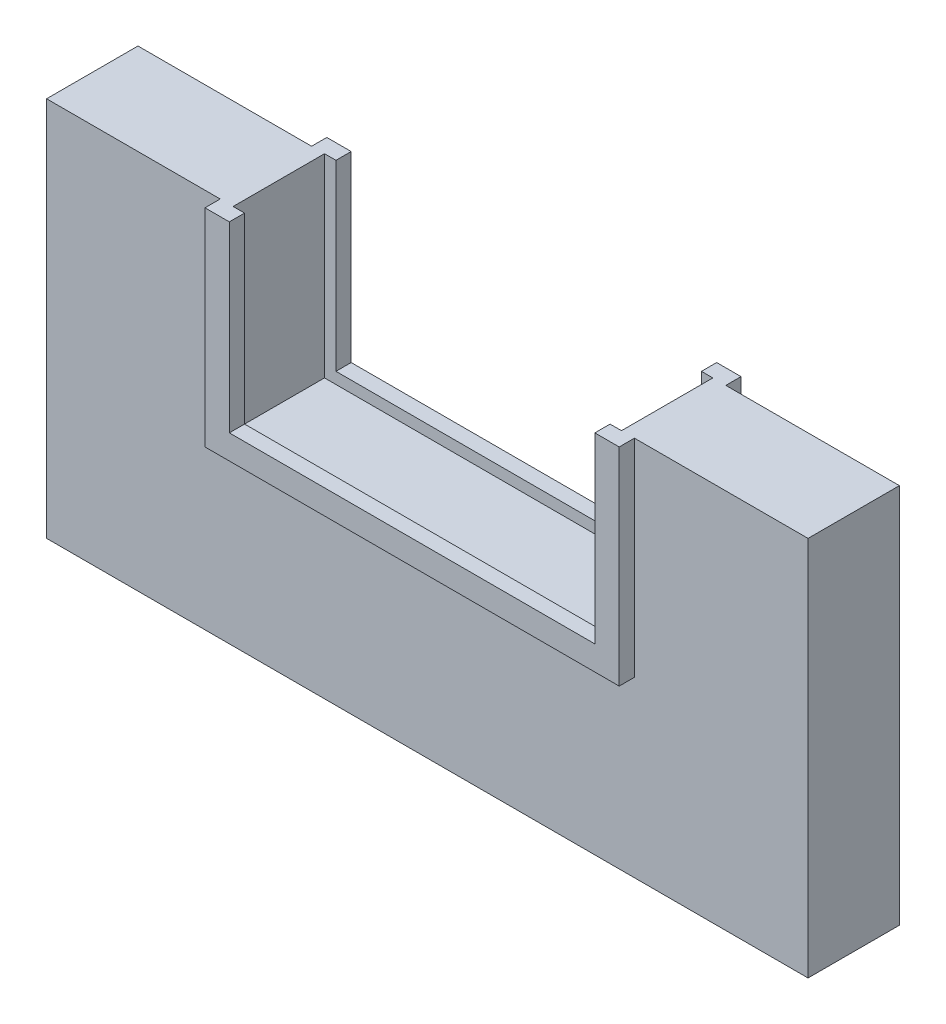
ISO-10303-21;
HEADER;
FILE_DESCRIPTION(('STEP AP214'),'2;1');
FILE_NAME('part.step','',(''),(''),'','','');
FILE_SCHEMA(('AUTOMOTIVE_DESIGN { 1 0 10303 214 1 1 1 1 }'));
ENDSEC;
DATA;
#1=APPLICATION_CONTEXT('core data for automotive mechanical design processes');
#2=APPLICATION_PROTOCOL_DEFINITION('international standard','automotive_design',2000,#1);
#3=PRODUCT_CONTEXT('',#1,'mechanical');
#4=PRODUCT('Part','Part','',(#3));
#5=PRODUCT_RELATED_PRODUCT_CATEGORY('part','',(#4));
#6=PRODUCT_DEFINITION_FORMATION('','',#4);
#7=PRODUCT_DEFINITION_CONTEXT('part definition',#1,'design');
#8=PRODUCT_DEFINITION('design','',#6,#7);
#9=PRODUCT_DEFINITION_SHAPE('','',#8);
#10=(LENGTH_UNIT() NAMED_UNIT(*) SI_UNIT(.MILLI.,.METRE.));
#11=(NAMED_UNIT(*) PLANE_ANGLE_UNIT() SI_UNIT($,.RADIAN.));
#12=(NAMED_UNIT(*) SI_UNIT($,.STERADIAN.) SOLID_ANGLE_UNIT());
#13=UNCERTAINTY_MEASURE_WITH_UNIT(LENGTH_MEASURE(1.E-05),#10,'distance_accuracy_value','');
#14=(GEOMETRIC_REPRESENTATION_CONTEXT(3) GLOBAL_UNCERTAINTY_ASSIGNED_CONTEXT((#13)) GLOBAL_UNIT_ASSIGNED_CONTEXT((#10,
#11,#12)) REPRESENTATION_CONTEXT('',''));
#15=CARTESIAN_POINT('',(0.,0.,0.));
#16=DIRECTION('',(0.,0.,1.));
#17=DIRECTION('',(1.,0.,0.));
#18=AXIS2_PLACEMENT_3D('',#15,#16,#17);
#19=CARTESIAN_POINT('',(12.5,6.25,3.));
#20=DIRECTION('',(0.,-1.,0.));
#21=DIRECTION('',(1.,0.,0.));
#22=AXIS2_PLACEMENT_3D('',#19,#20,#21);
#23=PLANE('',#22);
#24=DIRECTION('',(-1.,0.,0.));
#25=VECTOR('',#24,1.);
#26=CARTESIAN_POINT('',(-6.8,6.25,3.5));
#27=LINE('',#26,#25);
#28=CARTESIAN_POINT('',(-6.,6.25,3.5));
#29=VERTEX_POINT('',#28);
#30=CARTESIAN_POINT('',(-6.8,6.25,3.5));
#31=VERTEX_POINT('',#30);
#32=EDGE_CURVE('E318',#29,#31,#27,.T.);
#33=ORIENTED_EDGE('',*,*,#32,.F.);
#34=DIRECTION('',(0.,0.,1.));
#35=VECTOR('',#34,1.);
#36=CARTESIAN_POINT('',(-6.,6.25,-1.5));
#37=LINE('',#36,#35);
#38=CARTESIAN_POINT('',(-6.,6.25,3.));
#39=VERTEX_POINT('',#38);
#40=EDGE_CURVE('E215',#39,#29,#37,.T.);
#41=ORIENTED_EDGE('',*,*,#40,.F.);
#42=DIRECTION('',(-1.,0.,0.));
#43=VECTOR('',#42,1.);
#44=CARTESIAN_POINT('',(-6.375,6.25,3.));
#45=LINE('',#44,#43);
#46=CARTESIAN_POINT('',(-6.375,6.25,3.));
#47=VERTEX_POINT('',#46);
#48=EDGE_CURVE('E289',#39,#47,#45,.T.);
#49=ORIENTED_EDGE('',*,*,#48,.T.);
#50=DIRECTION('',(0.,0.,1.));
#51=VECTOR('',#50,1.);
#52=CARTESIAN_POINT('',(-6.375,6.25,0.));
#53=LINE('',#52,#51);
#54=CARTESIAN_POINT('',(-6.375,6.25,0.));
#55=VERTEX_POINT('',#54);
#56=EDGE_CURVE('E293',#55,#47,#53,.T.);
#57=ORIENTED_EDGE('',*,*,#56,.F.);
#58=DIRECTION('',(-1.,0.,0.));
#59=VECTOR('',#58,1.);
#60=CARTESIAN_POINT('',(-6.375,6.25,0.));
#61=LINE('',#60,#59);
#62=CARTESIAN_POINT('',(-6.,6.25,0.));
#63=VERTEX_POINT('',#62);
#64=EDGE_CURVE('E273',#63,#55,#61,.T.);
#65=ORIENTED_EDGE('',*,*,#64,.F.);
#66=CARTESIAN_POINT('',(-6.,6.25,-0.5));
#67=VERTEX_POINT('',#66);
#68=EDGE_CURVE('E229',#67,#63,#37,.T.);
#69=ORIENTED_EDGE('',*,*,#68,.F.);
#70=DIRECTION('',(-1.,0.,0.));
#71=VECTOR('',#70,1.);
#72=CARTESIAN_POINT('',(-6.8,6.25,-0.5));
#73=LINE('',#72,#71);
#74=CARTESIAN_POINT('',(-6.8,6.25,-0.5));
#75=VERTEX_POINT('',#74);
#76=EDGE_CURVE('E334',#67,#75,#73,.T.);
#77=ORIENTED_EDGE('',*,*,#76,.T.);
#78=DIRECTION('',(0.,0.,-1.));
#79=VECTOR('',#78,1.);
#80=CARTESIAN_POINT('',(-6.8,6.25,3.5));
#81=LINE('',#80,#79);
#82=CARTESIAN_POINT('',(-6.8,6.25,0.));
#83=VERTEX_POINT('',#82);
#84=EDGE_CURVE('E322',#83,#75,#81,.T.);
#85=ORIENTED_EDGE('',*,*,#84,.F.);
#86=DIRECTION('',(-1.,0.,0.));
#87=VECTOR('',#86,1.);
#88=CARTESIAN_POINT('',(12.5,6.25,0.));
#89=LINE('',#88,#87);
#90=CARTESIAN_POINT('',(-12.5,6.25,0.));
#91=VERTEX_POINT('',#90);
#92=EDGE_CURVE('E393',#83,#91,#89,.T.);
#93=ORIENTED_EDGE('',*,*,#92,.T.);
#94=DIRECTION('',(0.,0.,-1.));
#95=VECTOR('',#94,1.);
#96=CARTESIAN_POINT('',(-12.5,6.25,3.));
#97=LINE('',#96,#95);
#98=CARTESIAN_POINT('',(-12.5,6.25,3.));
#99=VERTEX_POINT('',#98);
#100=EDGE_CURVE('E383',#99,#91,#97,.T.);
#101=ORIENTED_EDGE('',*,*,#100,.F.);
#102=DIRECTION('',(-1.,0.,0.));
#103=VECTOR('',#102,1.);
#104=CARTESIAN_POINT('',(12.5,6.25,3.));
#105=LINE('',#104,#103);
#106=CARTESIAN_POINT('',(-6.8,6.25,3.));
#107=VERTEX_POINT('',#106);
#108=EDGE_CURVE('E379',#107,#99,#105,.T.);
#109=ORIENTED_EDGE('',*,*,#108,.F.);
#110=EDGE_CURVE('E338',#31,#107,#81,.T.);
#111=ORIENTED_EDGE('',*,*,#110,.F.);
#112=EDGE_LOOP('',(#33,#41,#49,#57,#65,#69,#77,#85,#93,#101,#109,#111));
#113=FACE_BOUND('',#112,.T.);
#114=ADVANCED_FACE('F39',(#113),#23,.F.);
#115=CARTESIAN_POINT('',(6.8,6.25,-0.5));
#116=VERTEX_POINT('',#115);
#117=CARTESIAN_POINT('',(6.,6.25,-0.5));
#118=VERTEX_POINT('',#117);
#119=EDGE_CURVE('E312',#116,#118,#73,.T.);
#120=ORIENTED_EDGE('',*,*,#119,.T.);
#121=DIRECTION('',(0.,0.,1.));
#122=VECTOR('',#121,1.);
#123=CARTESIAN_POINT('',(6.,6.25,-1.5));
#124=LINE('',#123,#122);
#125=CARTESIAN_POINT('',(6.,6.25,0.));
#126=VERTEX_POINT('',#125);
#127=EDGE_CURVE('E230',#118,#126,#124,.T.);
#128=ORIENTED_EDGE('',*,*,#127,.T.);
#129=CARTESIAN_POINT('',(6.375,6.25,0.));
#130=VERTEX_POINT('',#129);
#131=EDGE_CURVE('E274',#130,#126,#61,.T.);
#132=ORIENTED_EDGE('',*,*,#131,.F.);
#133=DIRECTION('',(0.,0.,1.));
#134=VECTOR('',#133,1.);
#135=CARTESIAN_POINT('',(6.375,6.25,0.));
#136=LINE('',#135,#134);
#137=CARTESIAN_POINT('',(6.375,6.25,3.));
#138=VERTEX_POINT('',#137);
#139=EDGE_CURVE('E298',#130,#138,#136,.T.);
#140=ORIENTED_EDGE('',*,*,#139,.T.);
#141=CARTESIAN_POINT('',(6.,6.25,3.));
#142=VERTEX_POINT('',#141);
#143=EDGE_CURVE('E265',#138,#142,#45,.T.);
#144=ORIENTED_EDGE('',*,*,#143,.T.);
#145=CARTESIAN_POINT('',(6.,6.25,3.5));
#146=VERTEX_POINT('',#145);
#147=EDGE_CURVE('E231',#142,#146,#124,.T.);
#148=ORIENTED_EDGE('',*,*,#147,.T.);
#149=CARTESIAN_POINT('',(6.8,6.25,3.5));
#150=VERTEX_POINT('',#149);
#151=EDGE_CURVE('E319',#150,#146,#27,.T.);
#152=ORIENTED_EDGE('',*,*,#151,.F.);
#153=DIRECTION('',(0.,0.,-1.));
#154=VECTOR('',#153,1.);
#155=CARTESIAN_POINT('',(6.8,6.25,3.5));
#156=LINE('',#155,#154);
#157=CARTESIAN_POINT('',(6.8,6.25,3.));
#158=VERTEX_POINT('',#157);
#159=EDGE_CURVE('E343',#150,#158,#156,.T.);
#160=ORIENTED_EDGE('',*,*,#159,.T.);
#161=CARTESIAN_POINT('',(12.5,6.25,3.));
#162=VERTEX_POINT('',#161);
#163=EDGE_CURVE('E380',#162,#158,#105,.T.);
#164=ORIENTED_EDGE('',*,*,#163,.F.);
#165=DIRECTION('',(0.,0.,-1.));
#166=VECTOR('',#165,1.);
#167=CARTESIAN_POINT('',(12.5,6.25,3.));
#168=LINE('',#167,#166);
#169=CARTESIAN_POINT('',(12.5,6.25,0.));
#170=VERTEX_POINT('',#169);
#171=EDGE_CURVE('E400',#162,#170,#168,.T.);
#172=ORIENTED_EDGE('',*,*,#171,.T.);
#173=CARTESIAN_POINT('',(6.8,6.25,0.));
#174=VERTEX_POINT('',#173);
#175=EDGE_CURVE('E373',#170,#174,#89,.T.);
#176=ORIENTED_EDGE('',*,*,#175,.T.);
#177=EDGE_CURVE('E342',#174,#116,#156,.T.);
#178=ORIENTED_EDGE('',*,*,#177,.T.);
#179=EDGE_LOOP('',(#120,#128,#132,#140,#144,#148,#152,#160,#164,#172,#176,#178));
#180=FACE_BOUND('',#179,.T.);
#181=ADVANCED_FACE('F432',(#180),#23,.F.);
#182=CARTESIAN_POINT('',(0.,0.,3.));
#183=DIRECTION('',(0.,0.,1.));
#184=DIRECTION('',(1.,0.,0.));
#185=AXIS2_PLACEMENT_3D('',#182,#183,#184);
#186=PLANE('',#185);
#187=DIRECTION('',(-1.,0.,0.));
#188=VECTOR('',#187,1.);
#189=CARTESIAN_POINT('',(0.,-0.550000000000001,3.));
#190=LINE('',#189,#188);
#191=CARTESIAN_POINT('',(6.80000000000001,-0.550000000000001,3.));
#192=VERTEX_POINT('',#191);
#193=CARTESIAN_POINT('',(-6.8,-0.550000000000001,3.));
#194=VERTEX_POINT('',#193);
#195=EDGE_CURVE('E360',#192,#194,#190,.T.);
#196=ORIENTED_EDGE('',*,*,#195,.T.);
#197=DIRECTION('',(0.,1.,0.));
#198=VECTOR('',#197,1.);
#199=CARTESIAN_POINT('',(-6.8,0.,3.));
#200=LINE('',#199,#198);
#201=EDGE_CURVE('E363',#194,#107,#200,.T.);
#202=ORIENTED_EDGE('',*,*,#201,.T.);
#203=ORIENTED_EDGE('',*,*,#108,.T.);
#204=DIRECTION('',(0.,-1.,0.));
#205=VECTOR('',#204,1.);
#206=CARTESIAN_POINT('',(-12.5,-6.25,3.));
#207=LINE('',#206,#205);
#208=CARTESIAN_POINT('',(-12.5,-6.25,3.));
#209=VERTEX_POINT('',#208);
#210=EDGE_CURVE('E368',#99,#209,#207,.T.);
#211=ORIENTED_EDGE('',*,*,#210,.T.);
#212=DIRECTION('',(1.,0.,0.));
#213=VECTOR('',#212,1.);
#214=CARTESIAN_POINT('',(12.5,-6.25,3.));
#215=LINE('',#214,#213);
#216=CARTESIAN_POINT('',(12.5,-6.25,3.));
#217=VERTEX_POINT('',#216);
#218=EDGE_CURVE('E372',#209,#217,#215,.T.);
#219=ORIENTED_EDGE('',*,*,#218,.T.);
#220=DIRECTION('',(0.,1.,0.));
#221=VECTOR('',#220,1.);
#222=CARTESIAN_POINT('',(12.5,-6.25,3.));
#223=LINE('',#222,#221);
#224=EDGE_CURVE('E376',#217,#162,#223,.T.);
#225=ORIENTED_EDGE('',*,*,#224,.T.);
#226=ORIENTED_EDGE('',*,*,#163,.T.);
#227=DIRECTION('',(0.,-1.,0.));
#228=VECTOR('',#227,1.);
#229=CARTESIAN_POINT('',(6.80000000000001,0.,3.));
#230=LINE('',#229,#228);
#231=EDGE_CURVE('E357',#158,#192,#230,.T.);
#232=ORIENTED_EDGE('',*,*,#231,.T.);
#233=EDGE_LOOP('',(#196,#202,#203,#211,#219,#225,#226,#232));
#234=FACE_BOUND('',#233,.T.);
#235=ADVANCED_FACE('F481',(#234),#186,.T.);
#236=CARTESIAN_POINT('',(0.,0.,0.));
#237=DIRECTION('',(0.,0.,1.));
#238=DIRECTION('',(1.,0.,0.));
#239=AXIS2_PLACEMENT_3D('',#236,#237,#238);
#240=PLANE('',#239);
#241=DIRECTION('',(0.,1.,0.));
#242=VECTOR('',#241,1.);
#243=CARTESIAN_POINT('',(-6.8,0.,0.));
#244=LINE('',#243,#242);
#245=CARTESIAN_POINT('',(-6.8,-0.550000000000001,0.));
#246=VERTEX_POINT('',#245);
#247=EDGE_CURVE('E418',#246,#83,#244,.T.);
#248=ORIENTED_EDGE('',*,*,#247,.F.);
#249=DIRECTION('',(-1.,0.,0.));
#250=VECTOR('',#249,1.);
#251=CARTESIAN_POINT('',(0.,-0.550000000000001,0.));
#252=LINE('',#251,#250);
#253=CARTESIAN_POINT('',(6.80000000000001,-0.550000000000001,0.));
#254=VERTEX_POINT('',#253);
#255=EDGE_CURVE('E415',#254,#246,#252,.T.);
#256=ORIENTED_EDGE('',*,*,#255,.F.);
#257=DIRECTION('',(0.,-1.,0.));
#258=VECTOR('',#257,1.);
#259=CARTESIAN_POINT('',(6.80000000000001,0.,0.));
#260=LINE('',#259,#258);
#261=EDGE_CURVE('E412',#174,#254,#260,.T.);
#262=ORIENTED_EDGE('',*,*,#261,.F.);
#263=ORIENTED_EDGE('',*,*,#175,.F.);
#264=DIRECTION('',(0.,1.,0.));
#265=VECTOR('',#264,1.);
#266=CARTESIAN_POINT('',(12.5,-6.25,0.));
#267=LINE('',#266,#265);
#268=CARTESIAN_POINT('',(12.5,-6.25,0.));
#269=VERTEX_POINT('',#268);
#270=EDGE_CURVE('E390',#269,#170,#267,.T.);
#271=ORIENTED_EDGE('',*,*,#270,.F.);
#272=DIRECTION('',(1.,0.,0.));
#273=VECTOR('',#272,1.);
#274=CARTESIAN_POINT('',(12.5,-6.25,0.));
#275=LINE('',#274,#273);
#276=CARTESIAN_POINT('',(-12.5,-6.25,0.));
#277=VERTEX_POINT('',#276);
#278=EDGE_CURVE('E387',#277,#269,#275,.T.);
#279=ORIENTED_EDGE('',*,*,#278,.F.);
#280=DIRECTION('',(0.,-1.,0.));
#281=VECTOR('',#280,1.);
#282=CARTESIAN_POINT('',(-12.5,-6.25,0.));
#283=LINE('',#282,#281);
#284=EDGE_CURVE('E367',#91,#277,#283,.T.);
#285=ORIENTED_EDGE('',*,*,#284,.F.);
#286=ORIENTED_EDGE('',*,*,#92,.F.);
#287=EDGE_LOOP('',(#248,#256,#262,#263,#271,#279,#285,#286));
#288=FACE_BOUND('',#287,.T.);
#289=ADVANCED_FACE('F484',(#288),#240,.F.);
#290=CARTESIAN_POINT('',(-12.5,-6.25,3.));
#291=DIRECTION('',(1.,0.,0.));
#292=DIRECTION('',(0.,0.,-1.));
#293=AXIS2_PLACEMENT_3D('',#290,#291,#292);
#294=PLANE('',#293);
#295=ORIENTED_EDGE('',*,*,#284,.T.);
#296=DIRECTION('',(0.,0.,-1.));
#297=VECTOR('',#296,1.);
#298=CARTESIAN_POINT('',(-12.5,-6.25,3.));
#299=LINE('',#298,#297);
#300=EDGE_CURVE('E408',#209,#277,#299,.T.);
#301=ORIENTED_EDGE('',*,*,#300,.F.);
#302=ORIENTED_EDGE('',*,*,#210,.F.);
#303=ORIENTED_EDGE('',*,*,#100,.T.);
#304=EDGE_LOOP('',(#295,#301,#302,#303));
#305=FACE_BOUND('',#304,.T.);
#306=ADVANCED_FACE('F41',(#305),#294,.F.);
#307=CARTESIAN_POINT('',(12.5,-6.25,3.));
#308=DIRECTION('',(0.,1.,0.));
#309=DIRECTION('',(-1.,0.,0.));
#310=AXIS2_PLACEMENT_3D('',#307,#308,#309);
#311=PLANE('',#310);
#312=ORIENTED_EDGE('',*,*,#278,.T.);
#313=DIRECTION('',(0.,0.,-1.));
#314=VECTOR('',#313,1.);
#315=CARTESIAN_POINT('',(12.5,-6.25,3.));
#316=LINE('',#315,#314);
#317=EDGE_CURVE('E404',#217,#269,#316,.T.);
#318=ORIENTED_EDGE('',*,*,#317,.F.);
#319=ORIENTED_EDGE('',*,*,#218,.F.);
#320=ORIENTED_EDGE('',*,*,#300,.T.);
#321=EDGE_LOOP('',(#312,#318,#319,#320));
#322=FACE_BOUND('',#321,.T.);
#323=ADVANCED_FACE('F489',(#322),#311,.F.);
#324=CARTESIAN_POINT('',(12.5,-6.25,3.));
#325=DIRECTION('',(-1.,0.,0.));
#326=DIRECTION('',(0.,0.,1.));
#327=AXIS2_PLACEMENT_3D('',#324,#325,#326);
#328=PLANE('',#327);
#329=ORIENTED_EDGE('',*,*,#270,.T.);
#330=ORIENTED_EDGE('',*,*,#171,.F.);
#331=ORIENTED_EDGE('',*,*,#224,.F.);
#332=ORIENTED_EDGE('',*,*,#317,.T.);
#333=EDGE_LOOP('',(#329,#330,#331,#332));
#334=FACE_BOUND('',#333,.T.);
#335=ADVANCED_FACE('F486',(#334),#328,.F.);
#336=CARTESIAN_POINT('',(0.,0.,-0.5));
#337=DIRECTION('',(0.,0.,1.));
#338=DIRECTION('',(1.,0.,0.));
#339=AXIS2_PLACEMENT_3D('',#336,#337,#338);
#340=PLANE('',#339);
#341=ORIENTED_EDGE('',*,*,#76,.F.);
#342=DIRECTION('',(0.,-1.,0.));
#343=VECTOR('',#342,1.);
#344=CARTESIAN_POINT('',(-6.,0.,-0.5));
#345=LINE('',#344,#343);
#346=CARTESIAN_POINT('',(-6.,0.249999999999999,-0.5));
#347=VERTEX_POINT('',#346);
#348=EDGE_CURVE('E255',#67,#347,#345,.T.);
#349=ORIENTED_EDGE('',*,*,#348,.T.);
#350=DIRECTION('',(1.,0.,0.));
#351=VECTOR('',#350,1.);
#352=CARTESIAN_POINT('',(0.,0.249999999999999,-0.5));
#353=LINE('',#352,#351);
#354=CARTESIAN_POINT('',(6.,0.249999999999999,-0.5));
#355=VERTEX_POINT('',#354);
#356=EDGE_CURVE('E241',#347,#355,#353,.T.);
#357=ORIENTED_EDGE('',*,*,#356,.T.);
#358=DIRECTION('',(0.,1.,0.));
#359=VECTOR('',#358,1.);
#360=CARTESIAN_POINT('',(6.,0.,-0.5));
#361=LINE('',#360,#359);
#362=EDGE_CURVE('E248',#355,#118,#361,.T.);
#363=ORIENTED_EDGE('',*,*,#362,.T.);
#364=ORIENTED_EDGE('',*,*,#119,.F.);
#365=DIRECTION('',(0.,1.,0.));
#366=VECTOR('',#365,1.);
#367=CARTESIAN_POINT('',(6.8,6.25,-0.5));
#368=LINE('',#367,#366);
#369=CARTESIAN_POINT('',(6.80000000000001,-0.550000000000001,-0.5));
#370=VERTEX_POINT('',#369);
#371=EDGE_CURVE('E330',#370,#116,#368,.T.);
#372=ORIENTED_EDGE('',*,*,#371,.F.);
#373=DIRECTION('',(1.,0.,0.));
#374=VECTOR('',#373,1.);
#375=CARTESIAN_POINT('',(-6.8,-0.550000000000001,-0.5));
#376=LINE('',#375,#374);
#377=CARTESIAN_POINT('',(-6.8,-0.550000000000001,-0.5));
#378=VERTEX_POINT('',#377);
#379=EDGE_CURVE('E326',#378,#370,#376,.T.);
#380=ORIENTED_EDGE('',*,*,#379,.F.);
#381=DIRECTION('',(0.,-1.,0.));
#382=VECTOR('',#381,1.);
#383=CARTESIAN_POINT('',(-6.8,6.25,-0.5));
#384=LINE('',#383,#382);
#385=EDGE_CURVE('E297',#75,#378,#384,.T.);
#386=ORIENTED_EDGE('',*,*,#385,.F.);
#387=EDGE_LOOP('',(#341,#349,#357,#363,#364,#372,#380,#386));
#388=FACE_BOUND('',#387,.T.);
#389=ADVANCED_FACE('F488',(#388),#340,.F.);
#390=CARTESIAN_POINT('',(6.8,6.25,3.5));
#391=DIRECTION('',(-1.,0.,0.));
#392=DIRECTION('',(0.,-1.,0.));
#393=AXIS2_PLACEMENT_3D('',#390,#391,#392);
#394=PLANE('',#393);
#395=ORIENTED_EDGE('',*,*,#177,.F.);
#396=ORIENTED_EDGE('',*,*,#261,.T.);
#397=DIRECTION('',(0.,0.,-1.));
#398=VECTOR('',#397,1.);
#399=CARTESIAN_POINT('',(6.80000000000001,-0.550000000000001,3.5));
#400=LINE('',#399,#398);
#401=EDGE_CURVE('E347',#254,#370,#400,.T.);
#402=ORIENTED_EDGE('',*,*,#401,.T.);
#403=ORIENTED_EDGE('',*,*,#371,.T.);
#404=EDGE_LOOP('',(#395,#396,#402,#403));
#405=FACE_BOUND('',#404,.T.);
#406=ADVANCED_FACE('F551',(#405),#394,.F.);
#407=CARTESIAN_POINT('',(-6.8,-0.550000000000001,3.5));
#408=DIRECTION('',(0.,1.,0.));
#409=DIRECTION('',(0.,0.,1.));
#410=AXIS2_PLACEMENT_3D('',#407,#408,#409);
#411=PLANE('',#410);
#412=ORIENTED_EDGE('',*,*,#401,.F.);
#413=ORIENTED_EDGE('',*,*,#255,.T.);
#414=DIRECTION('',(0.,0.,-1.));
#415=VECTOR('',#414,1.);
#416=CARTESIAN_POINT('',(-6.8,-0.550000000000001,3.5));
#417=LINE('',#416,#415);
#418=EDGE_CURVE('E352',#246,#378,#417,.T.);
#419=ORIENTED_EDGE('',*,*,#418,.T.);
#420=ORIENTED_EDGE('',*,*,#379,.T.);
#421=EDGE_LOOP('',(#412,#413,#419,#420));
#422=FACE_BOUND('',#421,.T.);
#423=ADVANCED_FACE('F549',(#422),#411,.F.);
#424=CARTESIAN_POINT('',(-6.8,6.25,3.5));
#425=DIRECTION('',(1.,0.,0.));
#426=DIRECTION('',(0.,1.,0.));
#427=AXIS2_PLACEMENT_3D('',#424,#425,#426);
#428=PLANE('',#427);
#429=ORIENTED_EDGE('',*,*,#418,.F.);
#430=ORIENTED_EDGE('',*,*,#247,.T.);
#431=ORIENTED_EDGE('',*,*,#84,.T.);
#432=ORIENTED_EDGE('',*,*,#385,.T.);
#433=EDGE_LOOP('',(#429,#430,#431,#432));
#434=FACE_BOUND('',#433,.T.);
#435=ADVANCED_FACE('F542',(#434),#428,.F.);
#436=ORIENTED_EDGE('',*,*,#201,.F.);
#437=CARTESIAN_POINT('',(-6.8,-0.550000000000001,3.5));
#438=VERTEX_POINT('',#437);
#439=EDGE_CURVE('E353',#438,#194,#417,.T.);
#440=ORIENTED_EDGE('',*,*,#439,.F.);
#441=DIRECTION('',(0.,-1.,0.));
#442=VECTOR('',#441,1.);
#443=CARTESIAN_POINT('',(-6.8,6.25,3.5));
#444=LINE('',#443,#442);
#445=EDGE_CURVE('E307',#31,#438,#444,.T.);
#446=ORIENTED_EDGE('',*,*,#445,.F.);
#447=ORIENTED_EDGE('',*,*,#110,.T.);
#448=EDGE_LOOP('',(#436,#440,#446,#447));
#449=FACE_BOUND('',#448,.T.);
#450=ADVANCED_FACE('F522',(#449),#428,.F.);
#451=ORIENTED_EDGE('',*,*,#195,.F.);
#452=CARTESIAN_POINT('',(6.80000000000001,-0.550000000000001,3.5));
#453=VERTEX_POINT('',#452);
#454=EDGE_CURVE('E348',#453,#192,#400,.T.);
#455=ORIENTED_EDGE('',*,*,#454,.F.);
#456=DIRECTION('',(1.,0.,0.));
#457=VECTOR('',#456,1.);
#458=CARTESIAN_POINT('',(-6.8,-0.550000000000001,3.5));
#459=LINE('',#458,#457);
#460=EDGE_CURVE('E311',#438,#453,#459,.T.);
#461=ORIENTED_EDGE('',*,*,#460,.F.);
#462=ORIENTED_EDGE('',*,*,#439,.T.);
#463=EDGE_LOOP('',(#451,#455,#461,#462));
#464=FACE_BOUND('',#463,.T.);
#465=ADVANCED_FACE('F518',(#464),#411,.F.);
#466=ORIENTED_EDGE('',*,*,#231,.F.);
#467=ORIENTED_EDGE('',*,*,#159,.F.);
#468=DIRECTION('',(0.,1.,0.));
#469=VECTOR('',#468,1.);
#470=CARTESIAN_POINT('',(6.8,6.25,3.5));
#471=LINE('',#470,#469);
#472=EDGE_CURVE('E315',#453,#150,#471,.T.);
#473=ORIENTED_EDGE('',*,*,#472,.F.);
#474=ORIENTED_EDGE('',*,*,#454,.T.);
#475=EDGE_LOOP('',(#466,#467,#473,#474));
#476=FACE_BOUND('',#475,.T.);
#477=ADVANCED_FACE('F514',(#476),#394,.F.);
#478=CARTESIAN_POINT('',(0.,0.,3.5));
#479=DIRECTION('',(0.,0.,1.));
#480=DIRECTION('',(1.,0.,0.));
#481=AXIS2_PLACEMENT_3D('',#478,#479,#480);
#482=PLANE('',#481);
#483=DIRECTION('',(0.,-1.,0.));
#484=VECTOR('',#483,1.);
#485=CARTESIAN_POINT('',(-6.,6.25,3.5));
#486=LINE('',#485,#484);
#487=CARTESIAN_POINT('',(-6.,0.249999999999999,3.5));
#488=VERTEX_POINT('',#487);
#489=EDGE_CURVE('E212',#29,#488,#486,.T.);
#490=ORIENTED_EDGE('',*,*,#489,.F.);
#491=ORIENTED_EDGE('',*,*,#32,.T.);
#492=ORIENTED_EDGE('',*,*,#445,.T.);
#493=ORIENTED_EDGE('',*,*,#460,.T.);
#494=ORIENTED_EDGE('',*,*,#472,.T.);
#495=ORIENTED_EDGE('',*,*,#151,.T.);
#496=DIRECTION('',(0.,1.,0.));
#497=VECTOR('',#496,1.);
#498=CARTESIAN_POINT('',(6.,6.25,3.5));
#499=LINE('',#498,#497);
#500=CARTESIAN_POINT('',(6.,0.249999999999999,3.5));
#501=VERTEX_POINT('',#500);
#502=EDGE_CURVE('E209',#501,#146,#499,.T.);
#503=ORIENTED_EDGE('',*,*,#502,.F.);
#504=DIRECTION('',(1.,0.,0.));
#505=VECTOR('',#504,1.);
#506=CARTESIAN_POINT('',(-6.,0.249999999999999,3.5));
#507=LINE('',#506,#505);
#508=EDGE_CURVE('E203',#488,#501,#507,.T.);
#509=ORIENTED_EDGE('',*,*,#508,.F.);
#510=EDGE_LOOP('',(#490,#491,#492,#493,#494,#495,#503,#509));
#511=FACE_BOUND('',#510,.T.);
#512=ADVANCED_FACE('F220',(#511),#482,.T.);
#513=CARTESIAN_POINT('',(-6.375,6.25,0.));
#514=DIRECTION('',(-1.,0.,0.));
#515=DIRECTION('',(0.,-1.,0.));
#516=AXIS2_PLACEMENT_3D('',#513,#514,#515);
#517=PLANE('',#516);
#518=DIRECTION('',(0.,-1.,0.));
#519=VECTOR('',#518,1.);
#520=CARTESIAN_POINT('',(-6.375,6.25,3.));
#521=LINE('',#520,#519);
#522=CARTESIAN_POINT('',(-6.375,-0.125000000000001,3.));
#523=VERTEX_POINT('',#522);
#524=EDGE_CURVE('E259',#47,#523,#521,.T.);
#525=ORIENTED_EDGE('',*,*,#524,.T.);
#526=DIRECTION('',(0.,0.,1.));
#527=VECTOR('',#526,1.);
#528=CARTESIAN_POINT('',(-6.375,-0.125000000000001,0.));
#529=LINE('',#528,#527);
#530=CARTESIAN_POINT('',(-6.375,-0.125000000000001,0.));
#531=VERTEX_POINT('',#530);
#532=EDGE_CURVE('E278',#531,#523,#529,.T.);
#533=ORIENTED_EDGE('',*,*,#532,.F.);
#534=DIRECTION('',(0.,-1.,0.));
#535=VECTOR('',#534,1.);
#536=CARTESIAN_POINT('',(-6.375,6.25,0.));
#537=LINE('',#536,#535);
#538=EDGE_CURVE('E260',#55,#531,#537,.T.);
#539=ORIENTED_EDGE('',*,*,#538,.F.);
#540=ORIENTED_EDGE('',*,*,#56,.T.);
#541=EDGE_LOOP('',(#525,#533,#539,#540));
#542=FACE_BOUND('',#541,.T.);
#543=ADVANCED_FACE('F450',(#542),#517,.F.);
#544=CARTESIAN_POINT('',(6.375,6.25,0.));
#545=DIRECTION('',(1.,0.,0.));
#546=DIRECTION('',(0.,1.,0.));
#547=AXIS2_PLACEMENT_3D('',#544,#545,#546);
#548=PLANE('',#547);
#549=DIRECTION('',(0.,1.,0.));
#550=VECTOR('',#549,1.);
#551=CARTESIAN_POINT('',(6.375,6.25,3.));
#552=LINE('',#551,#550);
#553=CARTESIAN_POINT('',(6.375,-0.125000000000001,3.));
#554=VERTEX_POINT('',#553);
#555=EDGE_CURVE('E286',#554,#138,#552,.T.);
#556=ORIENTED_EDGE('',*,*,#555,.T.);
#557=ORIENTED_EDGE('',*,*,#139,.F.);
#558=DIRECTION('',(0.,1.,0.));
#559=VECTOR('',#558,1.);
#560=CARTESIAN_POINT('',(6.375,6.25,0.));
#561=LINE('',#560,#559);
#562=CARTESIAN_POINT('',(6.375,-0.125000000000001,0.));
#563=VERTEX_POINT('',#562);
#564=EDGE_CURVE('E269',#563,#130,#561,.T.);
#565=ORIENTED_EDGE('',*,*,#564,.F.);
#566=DIRECTION('',(0.,0.,1.));
#567=VECTOR('',#566,1.);
#568=CARTESIAN_POINT('',(6.375,-0.125000000000001,0.));
#569=LINE('',#568,#567);
#570=EDGE_CURVE('E302',#563,#554,#569,.T.);
#571=ORIENTED_EDGE('',*,*,#570,.T.);
#572=EDGE_LOOP('',(#556,#557,#565,#571));
#573=FACE_BOUND('',#572,.T.);
#574=ADVANCED_FACE('F438',(#573),#548,.F.);
#575=CARTESIAN_POINT('',(-6.375,-0.125000000000001,0.));
#576=DIRECTION('',(0.,-1.,0.));
#577=DIRECTION('',(0.,0.,-1.));
#578=AXIS2_PLACEMENT_3D('',#575,#576,#577);
#579=PLANE('',#578);
#580=DIRECTION('',(1.,0.,0.));
#581=VECTOR('',#580,1.);
#582=CARTESIAN_POINT('',(-6.375,-0.125000000000001,3.));
#583=LINE('',#582,#581);
#584=EDGE_CURVE('E282',#523,#554,#583,.T.);
#585=ORIENTED_EDGE('',*,*,#584,.T.);
#586=ORIENTED_EDGE('',*,*,#570,.F.);
#587=DIRECTION('',(1.,0.,0.));
#588=VECTOR('',#587,1.);
#589=CARTESIAN_POINT('',(-6.375,-0.125000000000001,0.));
#590=LINE('',#589,#588);
#591=EDGE_CURVE('E264',#531,#563,#590,.T.);
#592=ORIENTED_EDGE('',*,*,#591,.F.);
#593=ORIENTED_EDGE('',*,*,#532,.T.);
#594=EDGE_LOOP('',(#585,#586,#592,#593));
#595=FACE_BOUND('',#594,.T.);
#596=ADVANCED_FACE('F446',(#595),#579,.F.);
#597=CARTESIAN_POINT('',(0.,0.,0.));
#598=DIRECTION('',(0.,0.,1.));
#599=DIRECTION('',(1.,0.,0.));
#600=AXIS2_PLACEMENT_3D('',#597,#598,#599);
#601=PLANE('',#600);
#602=DIRECTION('',(0.,-1.,0.));
#603=VECTOR('',#602,1.);
#604=CARTESIAN_POINT('',(-6.,0.,0.));
#605=LINE('',#604,#603);
#606=CARTESIAN_POINT('',(-6.,0.249999999999999,0.));
#607=VERTEX_POINT('',#606);
#608=EDGE_CURVE('E252',#63,#607,#605,.T.);
#609=ORIENTED_EDGE('',*,*,#608,.F.);
#610=ORIENTED_EDGE('',*,*,#64,.T.);
#611=ORIENTED_EDGE('',*,*,#538,.T.);
#612=ORIENTED_EDGE('',*,*,#591,.T.);
#613=ORIENTED_EDGE('',*,*,#564,.T.);
#614=ORIENTED_EDGE('',*,*,#131,.T.);
#615=DIRECTION('',(0.,1.,0.));
#616=VECTOR('',#615,1.);
#617=CARTESIAN_POINT('',(6.,0.,0.));
#618=LINE('',#617,#616);
#619=CARTESIAN_POINT('',(6.,0.249999999999999,0.));
#620=VERTEX_POINT('',#619);
#621=EDGE_CURVE('E245',#620,#126,#618,.T.);
#622=ORIENTED_EDGE('',*,*,#621,.F.);
#623=DIRECTION('',(1.,0.,0.));
#624=VECTOR('',#623,1.);
#625=CARTESIAN_POINT('',(0.,0.249999999999999,0.));
#626=LINE('',#625,#624);
#627=EDGE_CURVE('E238',#607,#620,#626,.T.);
#628=ORIENTED_EDGE('',*,*,#627,.F.);
#629=EDGE_LOOP('',(#609,#610,#611,#612,#613,#614,#622,#628));
#630=FACE_BOUND('',#629,.T.);
#631=ADVANCED_FACE('F441',(#630),#601,.T.);
#632=CARTESIAN_POINT('',(0.,0.,3.));
#633=DIRECTION('',(0.,0.,1.));
#634=DIRECTION('',(1.,0.,0.));
#635=AXIS2_PLACEMENT_3D('',#632,#633,#634);
#636=PLANE('',#635);
#637=ORIENTED_EDGE('',*,*,#48,.F.);
#638=DIRECTION('',(0.,-1.,0.));
#639=VECTOR('',#638,1.);
#640=CARTESIAN_POINT('',(-6.,0.,3.));
#641=LINE('',#640,#639);
#642=CARTESIAN_POINT('',(-6.,0.249999999999999,3.));
#643=VERTEX_POINT('',#642);
#644=EDGE_CURVE('E11',#39,#643,#641,.T.);
#645=ORIENTED_EDGE('',*,*,#644,.T.);
#646=DIRECTION('',(1.,0.,0.));
#647=VECTOR('',#646,1.);
#648=CARTESIAN_POINT('',(0.,0.249999999999999,3.));
#649=LINE('',#648,#647);
#650=CARTESIAN_POINT('',(6.,0.249999999999999,3.));
#651=VERTEX_POINT('',#650);
#652=EDGE_CURVE('E206',#643,#651,#649,.T.);
#653=ORIENTED_EDGE('',*,*,#652,.T.);
#654=DIRECTION('',(0.,1.,0.));
#655=VECTOR('',#654,1.);
#656=CARTESIAN_POINT('',(6.,0.,3.));
#657=LINE('',#656,#655);
#658=EDGE_CURVE('E48',#651,#142,#657,.T.);
#659=ORIENTED_EDGE('',*,*,#658,.T.);
#660=ORIENTED_EDGE('',*,*,#143,.F.);
#661=ORIENTED_EDGE('',*,*,#555,.F.);
#662=ORIENTED_EDGE('',*,*,#584,.F.);
#663=ORIENTED_EDGE('',*,*,#524,.F.);
#664=EDGE_LOOP('',(#637,#645,#653,#659,#660,#661,#662,#663));
#665=FACE_BOUND('',#664,.T.);
#666=ADVANCED_FACE('F428',(#665),#636,.F.);
#667=CARTESIAN_POINT('',(-6.,0.249999999999999,-1.5));
#668=DIRECTION('',(0.,-1.,0.));
#669=DIRECTION('',(0.,0.,-1.));
#670=AXIS2_PLACEMENT_3D('',#667,#668,#669);
#671=PLANE('',#670);
#672=DIRECTION('',(0.,0.,1.));
#673=VECTOR('',#672,1.);
#674=CARTESIAN_POINT('',(-6.,0.249999999999999,-1.5));
#675=LINE('',#674,#673);
#676=EDGE_CURVE('E199',#643,#488,#675,.T.);
#677=ORIENTED_EDGE('',*,*,#676,.T.);
#678=ORIENTED_EDGE('',*,*,#508,.T.);
#679=DIRECTION('',(0.,0.,1.));
#680=VECTOR('',#679,1.);
#681=CARTESIAN_POINT('',(6.,0.249999999999999,-1.5));
#682=LINE('',#681,#680);
#683=EDGE_CURVE('E63',#651,#501,#682,.T.);
#684=ORIENTED_EDGE('',*,*,#683,.F.);
#685=ORIENTED_EDGE('',*,*,#652,.F.);
#686=EDGE_LOOP('',(#677,#678,#684,#685));
#687=FACE_BOUND('',#686,.T.);
#688=ADVANCED_FACE('F201',(#687),#671,.F.);
#689=CARTESIAN_POINT('',(6.,6.25,-1.5));
#690=DIRECTION('',(1.,0.,0.));
#691=DIRECTION('',(0.,1.,0.));
#692=AXIS2_PLACEMENT_3D('',#689,#690,#691);
#693=PLANE('',#692);
#694=ORIENTED_EDGE('',*,*,#683,.T.);
#695=ORIENTED_EDGE('',*,*,#502,.T.);
#696=ORIENTED_EDGE('',*,*,#147,.F.);
#697=ORIENTED_EDGE('',*,*,#658,.F.);
#698=EDGE_LOOP('',(#694,#695,#696,#697));
#699=FACE_BOUND('',#698,.T.);
#700=ADVANCED_FACE('F473',(#699),#693,.F.);
#701=CARTESIAN_POINT('',(-6.,6.25,-1.5));
#702=DIRECTION('',(-1.,0.,0.));
#703=DIRECTION('',(0.,-1.,0.));
#704=AXIS2_PLACEMENT_3D('',#701,#702,#703);
#705=PLANE('',#704);
#706=ORIENTED_EDGE('',*,*,#40,.T.);
#707=ORIENTED_EDGE('',*,*,#489,.T.);
#708=ORIENTED_EDGE('',*,*,#676,.F.);
#709=ORIENTED_EDGE('',*,*,#644,.F.);
#710=EDGE_LOOP('',(#706,#707,#708,#709));
#711=FACE_BOUND('',#710,.T.);
#712=ADVANCED_FACE('F213',(#711),#705,.F.);
#713=ORIENTED_EDGE('',*,*,#68,.T.);
#714=ORIENTED_EDGE('',*,*,#608,.T.);
#715=EDGE_CURVE('E55',#347,#607,#675,.T.);
#716=ORIENTED_EDGE('',*,*,#715,.F.);
#717=ORIENTED_EDGE('',*,*,#348,.F.);
#718=EDGE_LOOP('',(#713,#714,#716,#717));
#719=FACE_BOUND('',#718,.T.);
#720=ADVANCED_FACE('F471',(#719),#705,.F.);
#721=EDGE_CURVE('E235',#355,#620,#682,.T.);
#722=ORIENTED_EDGE('',*,*,#721,.T.);
#723=ORIENTED_EDGE('',*,*,#621,.T.);
#724=ORIENTED_EDGE('',*,*,#127,.F.);
#725=ORIENTED_EDGE('',*,*,#362,.F.);
#726=EDGE_LOOP('',(#722,#723,#724,#725));
#727=FACE_BOUND('',#726,.T.);
#728=ADVANCED_FACE('F463',(#727),#693,.F.);
#729=ORIENTED_EDGE('',*,*,#715,.T.);
#730=ORIENTED_EDGE('',*,*,#627,.T.);
#731=ORIENTED_EDGE('',*,*,#721,.F.);
#732=ORIENTED_EDGE('',*,*,#356,.F.);
#733=EDGE_LOOP('',(#729,#730,#731,#732));
#734=FACE_BOUND('',#733,.T.);
#735=ADVANCED_FACE('F465',(#734),#671,.F.);
#736=CLOSED_SHELL('',(#114,#181,#235,#289,#306,#323,#335,#389,#406,#423,#435,#450,#465,#477,
#512,#543,#574,#596,#631,#666,#688,#700,#712,#720,#728,#735));
#737=MANIFOLD_SOLID_BREP('B2',#736);
#738=ADVANCED_BREP_SHAPE_REPRESENTATION('',(#18,#737),#14);
#739=SHAPE_DEFINITION_REPRESENTATION(#9,#738);
ENDSEC;
END-ISO-10303-21;
